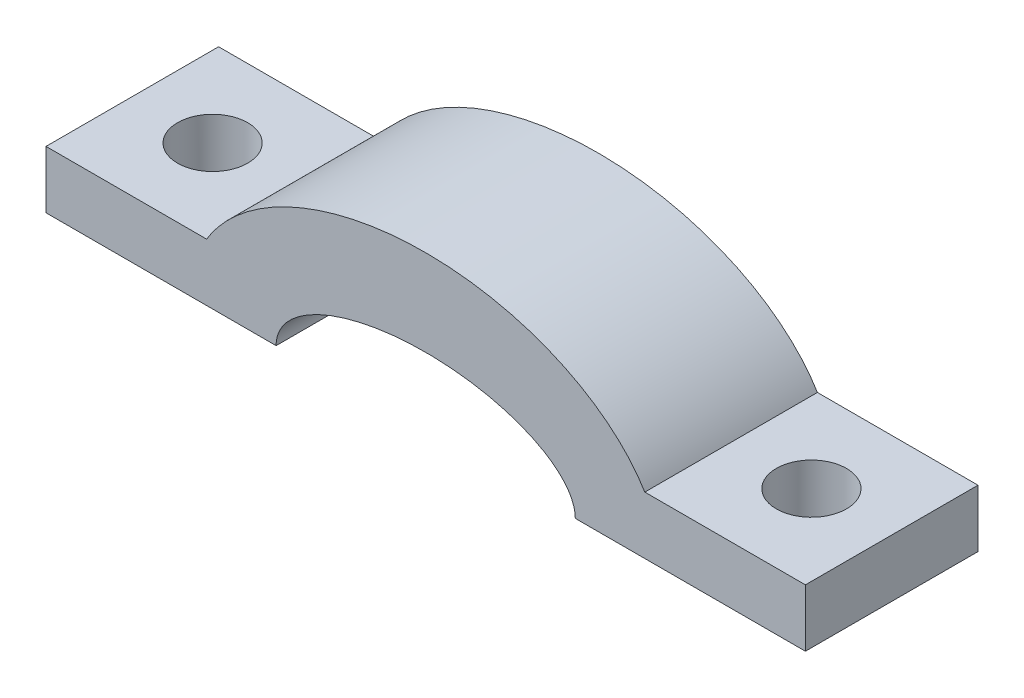
ISO-10303-21;
HEADER;
FILE_DESCRIPTION(('STEP AP214'),'2;1');
FILE_NAME('part.step','',(''),(''),'','','');
FILE_SCHEMA(('AUTOMOTIVE_DESIGN { 1 0 10303 214 1 1 1 1 }'));
ENDSEC;
DATA;
#1=APPLICATION_CONTEXT('core data for automotive mechanical design processes');
#2=APPLICATION_PROTOCOL_DEFINITION('international standard','automotive_design',2000,#1);
#3=PRODUCT_CONTEXT('',#1,'mechanical');
#4=PRODUCT('Part','Part','',(#3));
#5=PRODUCT_RELATED_PRODUCT_CATEGORY('part','',(#4));
#6=PRODUCT_DEFINITION_FORMATION('','',#4);
#7=PRODUCT_DEFINITION_CONTEXT('part definition',#1,'design');
#8=PRODUCT_DEFINITION('design','',#6,#7);
#9=PRODUCT_DEFINITION_SHAPE('','',#8);
#10=(LENGTH_UNIT() NAMED_UNIT(*) SI_UNIT(.MILLI.,.METRE.));
#11=(NAMED_UNIT(*) PLANE_ANGLE_UNIT() SI_UNIT($,.RADIAN.));
#12=(NAMED_UNIT(*) SI_UNIT($,.STERADIAN.) SOLID_ANGLE_UNIT());
#13=UNCERTAINTY_MEASURE_WITH_UNIT(LENGTH_MEASURE(1.E-05),#10,'distance_accuracy_value','');
#14=(GEOMETRIC_REPRESENTATION_CONTEXT(3) GLOBAL_UNCERTAINTY_ASSIGNED_CONTEXT((#13)) GLOBAL_UNIT_ASSIGNED_CONTEXT((#10,
#11,#12)) REPRESENTATION_CONTEXT('',''));
#15=CARTESIAN_POINT('',(0.,0.,0.));
#16=DIRECTION('',(0.,0.,1.));
#17=DIRECTION('',(1.,0.,0.));
#18=AXIS2_PLACEMENT_3D('',#15,#16,#17);
#19=CARTESIAN_POINT('',(0.,0.,15.));
#20=DIRECTION('',(0.,0.,1.));
#21=DIRECTION('',(1.,0.,0.));
#22=AXIS2_PLACEMENT_3D('',#19,#20,#21);
#23=ELLIPSE('',#22,20.5,13.5);
#24=DIRECTION('',(0.,0.,-1.));
#25=VECTOR('',#24,1.);
#26=SURFACE_OF_LINEAR_EXTRUSION('',#23,#25);
#27=DIRECTION('',(0.,0.,-1.));
#28=VECTOR('',#27,1.);
#29=CARTESIAN_POINT('',(19.0421253467912,5.,15.));
#30=LINE('',#29,#28);
#31=CARTESIAN_POINT('',(19.0421253467912,5.,0.));
#32=VERTEX_POINT('',#31);
#33=CARTESIAN_POINT('',(19.0421253467912,5.,15.));
#34=VERTEX_POINT('',#33);
#35=EDGE_CURVE('E67',#32,#34,#30,.F.);
#36=ORIENTED_EDGE('',*,*,#35,.F.);
#37=CARTESIAN_POINT('',(0.,0.,0.));
#38=DIRECTION('',(0.,0.,1.));
#39=DIRECTION('',(1.,0.,0.));
#40=AXIS2_PLACEMENT_3D('',#37,#38,#39);
#41=ELLIPSE('',#40,20.5,13.5);
#42=CARTESIAN_POINT('',(-19.0421253467912,5.,0.));
#43=VERTEX_POINT('',#42);
#44=EDGE_CURVE('E119',#32,#43,#41,.T.);
#45=ORIENTED_EDGE('',*,*,#44,.T.);
#46=DIRECTION('',(0.,0.,-1.));
#47=VECTOR('',#46,1.);
#48=CARTESIAN_POINT('',(-19.0421253467912,5.,15.));
#49=LINE('',#48,#47);
#50=CARTESIAN_POINT('',(-19.0421253467912,5.,15.));
#51=VERTEX_POINT('',#50);
#52=EDGE_CURVE('E148',#43,#51,#49,.F.);
#53=ORIENTED_EDGE('',*,*,#52,.T.);
#54=EDGE_CURVE('E63',#34,#51,#23,.T.);
#55=ORIENTED_EDGE('',*,*,#54,.F.);
#56=EDGE_LOOP('',(#36,#45,#53,#55));
#57=FACE_BOUND('',#56,.T.);
#58=ADVANCED_FACE('F47',(#57),#26,.F.);
#59=CARTESIAN_POINT('',(0.,0.,15.));
#60=DIRECTION('',(0.,1.,0.));
#61=DIRECTION('',(0.,0.,1.));
#62=AXIS2_PLACEMENT_3D('',#59,#60,#61);
#63=PLANE('',#62);
#64=CARTESIAN_POINT('',(26.0210626733956,0.,7.5));
#65=DIRECTION('',(0.,1.,0.));
#66=DIRECTION('',(0.,0.,1.));
#67=AXIS2_PLACEMENT_3D('',#64,#65,#66);
#68=CIRCLE('',#67,3.05);
#69=CARTESIAN_POINT('',(26.0210626733956,0.,10.55));
#70=VERTEX_POINT('',#69);
#71=EDGE_CURVE('E343',#70,#70,#68,.T.);
#72=ORIENTED_EDGE('',*,*,#71,.T.);
#73=EDGE_LOOP('',(#72));
#74=FACE_BOUND('',#73,.T.);
#75=DIRECTION('',(1.,0.,0.));
#76=VECTOR('',#75,1.);
#77=CARTESIAN_POINT('',(0.,0.,0.));
#78=LINE('',#77,#76);
#79=CARTESIAN_POINT('',(13.,0.,0.));
#80=VERTEX_POINT('',#79);
#81=CARTESIAN_POINT('',(33.,0.,0.));
#82=VERTEX_POINT('',#81);
#83=EDGE_CURVE('E176',#80,#82,#78,.T.);
#84=ORIENTED_EDGE('',*,*,#83,.T.);
#85=DIRECTION('',(0.,0.,1.));
#86=VECTOR('',#85,1.);
#87=CARTESIAN_POINT('',(33.,0.,15.));
#88=LINE('',#87,#86);
#89=CARTESIAN_POINT('',(33.,0.,15.));
#90=VERTEX_POINT('',#89);
#91=EDGE_CURVE('E124',#82,#90,#88,.T.);
#92=ORIENTED_EDGE('',*,*,#91,.T.);
#93=DIRECTION('',(1.,0.,0.));
#94=VECTOR('',#93,1.);
#95=CARTESIAN_POINT('',(0.,0.,15.));
#96=LINE('',#95,#94);
#97=CARTESIAN_POINT('',(13.,0.,15.));
#98=VERTEX_POINT('',#97);
#99=EDGE_CURVE('E177',#98,#90,#96,.T.);
#100=ORIENTED_EDGE('',*,*,#99,.F.);
#101=DIRECTION('',(0.,0.,-1.));
#102=VECTOR('',#101,1.);
#103=CARTESIAN_POINT('',(13.,0.,15.));
#104=LINE('',#103,#102);
#105=EDGE_CURVE('E56',#98,#80,#104,.T.);
#106=ORIENTED_EDGE('',*,*,#105,.T.);
#107=EDGE_LOOP('',(#84,#92,#100,#106));
#108=FACE_BOUND('',#107,.T.);
#109=ADVANCED_FACE('F199',(#74,#108),#63,.F.);
#110=CARTESIAN_POINT('',(-26.0210626733956,0.,7.50000000000001));
#111=DIRECTION('',(0.,1.,0.));
#112=DIRECTION('',(0.,0.,1.));
#113=AXIS2_PLACEMENT_3D('',#110,#111,#112);
#114=CIRCLE('',#113,3.05);
#115=CARTESIAN_POINT('',(-26.0210626733956,0.,10.55));
#116=VERTEX_POINT('',#115);
#117=EDGE_CURVE('E159',#116,#116,#114,.T.);
#118=ORIENTED_EDGE('',*,*,#117,.T.);
#119=EDGE_LOOP('',(#118));
#120=FACE_BOUND('',#119,.T.);
#121=CARTESIAN_POINT('',(-33.,0.,0.));
#122=VERTEX_POINT('',#121);
#123=CARTESIAN_POINT('',(-13.,0.,0.));
#124=VERTEX_POINT('',#123);
#125=EDGE_CURVE('E322',#122,#124,#78,.T.);
#126=ORIENTED_EDGE('',*,*,#125,.T.);
#127=DIRECTION('',(0.,0.,-1.));
#128=VECTOR('',#127,1.);
#129=CARTESIAN_POINT('',(-13.,0.,15.));
#130=LINE('',#129,#128);
#131=CARTESIAN_POINT('',(-13.,0.,15.));
#132=VERTEX_POINT('',#131);
#133=EDGE_CURVE('E11',#132,#124,#130,.T.);
#134=ORIENTED_EDGE('',*,*,#133,.F.);
#135=CARTESIAN_POINT('',(-33.,0.,15.));
#136=VERTEX_POINT('',#135);
#137=EDGE_CURVE('E180',#136,#132,#96,.T.);
#138=ORIENTED_EDGE('',*,*,#137,.F.);
#139=DIRECTION('',(0.,0.,-1.));
#140=VECTOR('',#139,1.);
#141=CARTESIAN_POINT('',(-33.,0.,15.));
#142=LINE('',#141,#140);
#143=EDGE_CURVE('E146',#136,#122,#142,.T.);
#144=ORIENTED_EDGE('',*,*,#143,.T.);
#145=EDGE_LOOP('',(#126,#134,#138,#144));
#146=FACE_BOUND('',#145,.T.);
#147=ADVANCED_FACE('F195',(#120,#146),#63,.F.);
#148=CARTESIAN_POINT('',(0.,0.,15.));
#149=DIRECTION('',(0.,0.,1.));
#150=DIRECTION('',(1.,0.,0.));
#151=AXIS2_PLACEMENT_3D('',#148,#149,#150);
#152=ELLIPSE('',#151,13.,6.);
#153=DIRECTION('',(0.,0.,-1.));
#154=VECTOR('',#153,1.);
#155=SURFACE_OF_LINEAR_EXTRUSION('',#152,#154);
#156=CARTESIAN_POINT('',(0.,0.,0.));
#157=DIRECTION('',(0.,0.,1.));
#158=DIRECTION('',(1.,0.,0.));
#159=AXIS2_PLACEMENT_3D('',#156,#157,#158);
#160=ELLIPSE('',#159,13.,6.);
#161=EDGE_CURVE('E179',#80,#124,#160,.T.);
#162=ORIENTED_EDGE('',*,*,#161,.F.);
#163=ORIENTED_EDGE('',*,*,#105,.F.);
#164=EDGE_CURVE('E184',#98,#132,#152,.T.);
#165=ORIENTED_EDGE('',*,*,#164,.T.);
#166=ORIENTED_EDGE('',*,*,#133,.T.);
#167=EDGE_LOOP('',(#162,#163,#165,#166));
#168=FACE_BOUND('',#167,.T.);
#169=ADVANCED_FACE('F191',(#168),#155,.T.);
#170=CARTESIAN_POINT('',(0.,0.,15.));
#171=DIRECTION('',(0.,0.,1.));
#172=DIRECTION('',(1.,0.,0.));
#173=AXIS2_PLACEMENT_3D('',#170,#171,#172);
#174=PLANE('',#173);
#175=ORIENTED_EDGE('',*,*,#164,.F.);
#176=ORIENTED_EDGE('',*,*,#99,.T.);
#177=DIRECTION('',(0.,-1.,0.));
#178=VECTOR('',#177,1.);
#179=CARTESIAN_POINT('',(33.,5.,15.));
#180=LINE('',#179,#178);
#181=CARTESIAN_POINT('',(33.,5.,15.));
#182=VERTEX_POINT('',#181);
#183=EDGE_CURVE('E133',#182,#90,#180,.T.);
#184=ORIENTED_EDGE('',*,*,#183,.F.);
#185=DIRECTION('',(-1.,0.,0.));
#186=VECTOR('',#185,1.);
#187=CARTESIAN_POINT('',(13.,5.,15.));
#188=LINE('',#187,#186);
#189=EDGE_CURVE('E134',#182,#34,#188,.T.);
#190=ORIENTED_EDGE('',*,*,#189,.T.);
#191=ORIENTED_EDGE('',*,*,#54,.T.);
#192=DIRECTION('',(-1.,0.,0.));
#193=VECTOR('',#192,1.);
#194=CARTESIAN_POINT('',(-13.,5.,15.));
#195=LINE('',#194,#193);
#196=CARTESIAN_POINT('',(-33.,5.,15.));
#197=VERTEX_POINT('',#196);
#198=EDGE_CURVE('E163',#51,#197,#195,.T.);
#199=ORIENTED_EDGE('',*,*,#198,.T.);
#200=DIRECTION('',(0.,-1.,0.));
#201=VECTOR('',#200,1.);
#202=CARTESIAN_POINT('',(-33.,5.,15.));
#203=LINE('',#202,#201);
#204=EDGE_CURVE('E150',#197,#136,#203,.T.);
#205=ORIENTED_EDGE('',*,*,#204,.T.);
#206=ORIENTED_EDGE('',*,*,#137,.T.);
#207=EDGE_LOOP('',(#175,#176,#184,#190,#191,#199,#205,#206));
#208=FACE_BOUND('',#207,.T.);
#209=ADVANCED_FACE('F194',(#208),#174,.T.);
#210=CARTESIAN_POINT('',(0.,0.,0.));
#211=DIRECTION('',(0.,0.,1.));
#212=DIRECTION('',(1.,0.,0.));
#213=AXIS2_PLACEMENT_3D('',#210,#211,#212);
#214=PLANE('',#213);
#215=ORIENTED_EDGE('',*,*,#83,.F.);
#216=ORIENTED_EDGE('',*,*,#161,.T.);
#217=ORIENTED_EDGE('',*,*,#125,.F.);
#218=DIRECTION('',(0.,-1.,0.));
#219=VECTOR('',#218,1.);
#220=CARTESIAN_POINT('',(-33.,5.,0.));
#221=LINE('',#220,#219);
#222=CARTESIAN_POINT('',(-33.,5.,0.));
#223=VERTEX_POINT('',#222);
#224=EDGE_CURVE('E155',#223,#122,#221,.T.);
#225=ORIENTED_EDGE('',*,*,#224,.F.);
#226=DIRECTION('',(1.,0.,0.));
#227=VECTOR('',#226,1.);
#228=CARTESIAN_POINT('',(-13.,5.,0.));
#229=LINE('',#228,#227);
#230=EDGE_CURVE('E154',#223,#43,#229,.T.);
#231=ORIENTED_EDGE('',*,*,#230,.T.);
#232=ORIENTED_EDGE('',*,*,#44,.F.);
#233=DIRECTION('',(1.,0.,0.));
#234=VECTOR('',#233,1.);
#235=CARTESIAN_POINT('',(13.,5.,0.));
#236=LINE('',#235,#234);
#237=CARTESIAN_POINT('',(33.,5.,0.));
#238=VERTEX_POINT('',#237);
#239=EDGE_CURVE('E112',#32,#238,#236,.T.);
#240=ORIENTED_EDGE('',*,*,#239,.T.);
#241=DIRECTION('',(0.,-1.,0.));
#242=VECTOR('',#241,1.);
#243=CARTESIAN_POINT('',(33.,5.,0.));
#244=LINE('',#243,#242);
#245=EDGE_CURVE('E116',#238,#82,#244,.T.);
#246=ORIENTED_EDGE('',*,*,#245,.T.);
#247=EDGE_LOOP('',(#215,#216,#217,#225,#231,#232,#240,#246));
#248=FACE_BOUND('',#247,.T.);
#249=ADVANCED_FACE('F115',(#248),#214,.F.);
#250=CARTESIAN_POINT('',(0.,5.,0.));
#251=DIRECTION('',(0.,1.,0.));
#252=DIRECTION('',(0.,0.,1.));
#253=AXIS2_PLACEMENT_3D('',#250,#251,#252);
#254=PLANE('',#253);
#255=CARTESIAN_POINT('',(-26.0210626733956,5.,7.50000000000001));
#256=DIRECTION('',(0.,1.,0.));
#257=DIRECTION('',(0.,0.,-1.));
#258=AXIS2_PLACEMENT_3D('',#255,#256,#257);
#259=CIRCLE('',#258,3.05);
#260=CARTESIAN_POINT('',(-26.0210626733956,5.,4.45));
#261=VERTEX_POINT('',#260);
#262=EDGE_CURVE('E318',#261,#261,#259,.T.);
#263=ORIENTED_EDGE('',*,*,#262,.F.);
#264=EDGE_LOOP('',(#263));
#265=FACE_BOUND('',#264,.T.);
#266=ORIENTED_EDGE('',*,*,#52,.F.);
#267=ORIENTED_EDGE('',*,*,#230,.F.);
#268=DIRECTION('',(0.,0.,-1.));
#269=VECTOR('',#268,1.);
#270=CARTESIAN_POINT('',(-33.,5.,15.));
#271=LINE('',#270,#269);
#272=EDGE_CURVE('E166',#197,#223,#271,.T.);
#273=ORIENTED_EDGE('',*,*,#272,.F.);
#274=ORIENTED_EDGE('',*,*,#198,.F.);
#275=EDGE_LOOP('',(#266,#267,#273,#274));
#276=FACE_BOUND('',#275,.T.);
#277=ADVANCED_FACE('F229',(#265,#276),#254,.T.);
#278=CARTESIAN_POINT('',(-33.,5.,15.));
#279=DIRECTION('',(-1.,0.,0.));
#280=DIRECTION('',(0.,0.,1.));
#281=AXIS2_PLACEMENT_3D('',#278,#279,#280);
#282=PLANE('',#281);
#283=ORIENTED_EDGE('',*,*,#143,.F.);
#284=ORIENTED_EDGE('',*,*,#204,.F.);
#285=ORIENTED_EDGE('',*,*,#272,.T.);
#286=ORIENTED_EDGE('',*,*,#224,.T.);
#287=EDGE_LOOP('',(#283,#284,#285,#286));
#288=FACE_BOUND('',#287,.T.);
#289=ADVANCED_FACE('F233',(#288),#282,.T.);
#290=CARTESIAN_POINT('',(0.,5.,0.));
#291=DIRECTION('',(0.,-1.,0.));
#292=DIRECTION('',(0.,0.,-1.));
#293=AXIS2_PLACEMENT_3D('',#290,#291,#292);
#294=PLANE('',#293);
#295=CARTESIAN_POINT('',(26.0210626733956,5.,7.5));
#296=DIRECTION('',(0.,1.,0.));
#297=DIRECTION('',(0.,0.,1.));
#298=AXIS2_PLACEMENT_3D('',#295,#296,#297);
#299=CIRCLE('',#298,3.05);
#300=CARTESIAN_POINT('',(26.0210626733956,5.,10.55));
#301=VERTEX_POINT('',#300);
#302=EDGE_CURVE('E339',#301,#301,#299,.T.);
#303=ORIENTED_EDGE('',*,*,#302,.F.);
#304=EDGE_LOOP('',(#303));
#305=FACE_BOUND('',#304,.T.);
#306=ORIENTED_EDGE('',*,*,#239,.F.);
#307=ORIENTED_EDGE('',*,*,#35,.T.);
#308=ORIENTED_EDGE('',*,*,#189,.F.);
#309=DIRECTION('',(0.,0.,1.));
#310=VECTOR('',#309,1.);
#311=CARTESIAN_POINT('',(33.,5.,15.));
#312=LINE('',#311,#310);
#313=EDGE_CURVE('E123',#238,#182,#312,.T.);
#314=ORIENTED_EDGE('',*,*,#313,.F.);
#315=EDGE_LOOP('',(#306,#307,#308,#314));
#316=FACE_BOUND('',#315,.T.);
#317=ADVANCED_FACE('F136',(#305,#316),#294,.F.);
#318=CARTESIAN_POINT('',(33.,5.,15.));
#319=DIRECTION('',(1.,0.,0.));
#320=DIRECTION('',(0.,0.,-1.));
#321=AXIS2_PLACEMENT_3D('',#318,#319,#320);
#322=PLANE('',#321);
#323=ORIENTED_EDGE('',*,*,#91,.F.);
#324=ORIENTED_EDGE('',*,*,#245,.F.);
#325=ORIENTED_EDGE('',*,*,#313,.T.);
#326=ORIENTED_EDGE('',*,*,#183,.T.);
#327=EDGE_LOOP('',(#323,#324,#325,#326));
#328=FACE_BOUND('',#327,.T.);
#329=ADVANCED_FACE('F128',(#328),#322,.T.);
#330=CARTESIAN_POINT('',(26.0210626733956,-5.,7.5));
#331=DIRECTION('',(0.,1.,0.));
#332=DIRECTION('',(0.,0.,1.));
#333=AXIS2_PLACEMENT_3D('',#330,#331,#332);
#334=CYLINDRICAL_SURFACE('',#333,3.05);
#335=ORIENTED_EDGE('',*,*,#302,.T.);
#336=EDGE_LOOP('',(#335));
#337=FACE_BOUND('',#336,.T.);
#338=ORIENTED_EDGE('',*,*,#71,.F.);
#339=EDGE_LOOP('',(#338));
#340=FACE_BOUND('',#339,.T.);
#341=ADVANCED_FACE('F245',(#337,#340),#334,.F.);
#342=CARTESIAN_POINT('',(-26.0210626733956,-5.,7.50000000000001));
#343=DIRECTION('',(0.,1.,0.));
#344=DIRECTION('',(0.,0.,1.));
#345=AXIS2_PLACEMENT_3D('',#342,#343,#344);
#346=CYLINDRICAL_SURFACE('',#345,3.05);
#347=ORIENTED_EDGE('',*,*,#262,.T.);
#348=EDGE_LOOP('',(#347));
#349=FACE_BOUND('',#348,.T.);
#350=ORIENTED_EDGE('',*,*,#117,.F.);
#351=EDGE_LOOP('',(#350));
#352=FACE_BOUND('',#351,.T.);
#353=ADVANCED_FACE('F296',(#349,#352),#346,.F.);
#354=CLOSED_SHELL('',(#58,#109,#147,#169,#209,#249,#277,#289,#317,#329,#341,#353));
#355=MANIFOLD_SOLID_BREP('B2',#354);
#356=ADVANCED_BREP_SHAPE_REPRESENTATION('',(#18,#355),#14);
#357=SHAPE_DEFINITION_REPRESENTATION(#9,#356);
ENDSEC;
END-ISO-10303-21;
